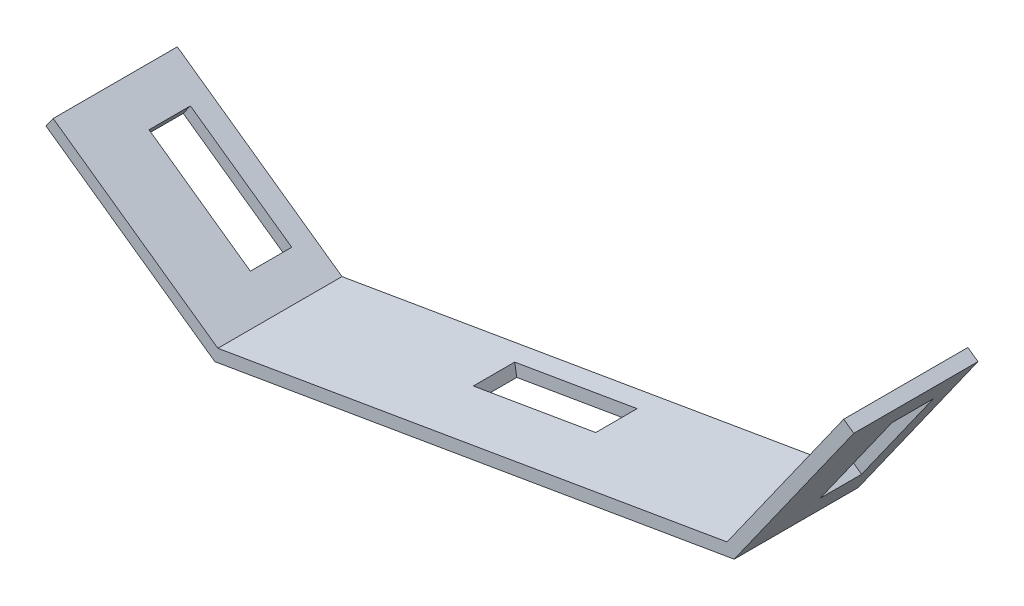
ISO-10303-21;
HEADER;
FILE_DESCRIPTION(('STEP AP214'),'2;1');
FILE_NAME('part.step','',(''),(''),'','','');
FILE_SCHEMA(('AUTOMOTIVE_DESIGN { 1 0 10303 214 1 1 1 1 }'));
ENDSEC;
DATA;
#1=APPLICATION_CONTEXT('core data for automotive mechanical design processes');
#2=APPLICATION_PROTOCOL_DEFINITION('international standard','automotive_design',2000,#1);
#3=PRODUCT_CONTEXT('',#1,'mechanical');
#4=PRODUCT('Part','Part','',(#3));
#5=PRODUCT_RELATED_PRODUCT_CATEGORY('part','',(#4));
#6=PRODUCT_DEFINITION_FORMATION('','',#4);
#7=PRODUCT_DEFINITION_CONTEXT('part definition',#1,'design');
#8=PRODUCT_DEFINITION('design','',#6,#7);
#9=PRODUCT_DEFINITION_SHAPE('','',#8);
#10=(LENGTH_UNIT() NAMED_UNIT(*) SI_UNIT(.MILLI.,.METRE.));
#11=(NAMED_UNIT(*) PLANE_ANGLE_UNIT() SI_UNIT($,.RADIAN.));
#12=(NAMED_UNIT(*) SI_UNIT($,.STERADIAN.) SOLID_ANGLE_UNIT());
#13=UNCERTAINTY_MEASURE_WITH_UNIT(LENGTH_MEASURE(1.E-05),#10,'distance_accuracy_value','');
#14=(GEOMETRIC_REPRESENTATION_CONTEXT(3) GLOBAL_UNCERTAINTY_ASSIGNED_CONTEXT((#13)) GLOBAL_UNIT_ASSIGNED_CONTEXT((#10,
#11,#12)) REPRESENTATION_CONTEXT('',''));
#15=CARTESIAN_POINT('',(0.,0.,0.));
#16=DIRECTION('',(0.,0.,1.));
#17=DIRECTION('',(1.,0.,0.));
#18=AXIS2_PLACEMENT_3D('',#15,#16,#17);
#19=CARTESIAN_POINT('',(-52.8419941794562,15.4027205499136,30.));
#20=DIRECTION('',(0.815952564194871,-0.578118857142556,0.));
#21=DIRECTION('',(0.578118857142556,0.815952564194871,0.));
#22=AXIS2_PLACEMENT_3D('',#19,#20,#21);
#23=PLANE('',#22);
#24=DIRECTION('',(-0.578118857142556,-0.815952564194871,0.));
#25=VECTOR('',#24,1.);
#26=CARTESIAN_POINT('',(-52.8419941794562,15.4027205499136,0.));
#27=LINE('',#26,#25);
#28=CARTESIAN_POINT('',(-51.1076376080285,17.8505782424982,0.));
#29=VERTEX_POINT('',#28);
#30=CARTESIAN_POINT('',(-52.8419941794562,15.4027205499136,0.));
#31=VERTEX_POINT('',#30);
#32=EDGE_CURVE('E239',#29,#31,#27,.T.);
#33=ORIENTED_EDGE('',*,*,#32,.T.);
#34=DIRECTION('',(0.,0.,-1.));
#35=VECTOR('',#34,1.);
#36=CARTESIAN_POINT('',(-52.8419941794562,15.4027205499136,30.));
#37=LINE('',#36,#35);
#38=CARTESIAN_POINT('',(-52.8419941794562,15.4027205499136,30.));
#39=VERTEX_POINT('',#38);
#40=EDGE_CURVE('E300',#39,#31,#37,.T.);
#41=ORIENTED_EDGE('',*,*,#40,.F.);
#42=DIRECTION('',(-0.578118857142556,-0.815952564194871,0.));
#43=VECTOR('',#42,1.);
#44=CARTESIAN_POINT('',(-52.8419941794562,15.4027205499136,30.));
#45=LINE('',#44,#43);
#46=CARTESIAN_POINT('',(-51.1076376080285,17.8505782424982,30.));
#47=VERTEX_POINT('',#46);
#48=EDGE_CURVE('E246',#47,#39,#45,.T.);
#49=ORIENTED_EDGE('',*,*,#48,.F.);
#50=DIRECTION('',(0.,0.,-1.));
#51=VECTOR('',#50,1.);
#52=CARTESIAN_POINT('',(-51.1076376080285,17.8505782424982,30.));
#53=LINE('',#52,#51);
#54=EDGE_CURVE('E264',#47,#29,#53,.T.);
#55=ORIENTED_EDGE('',*,*,#54,.T.);
#56=EDGE_LOOP('',(#33,#41,#49,#55));
#57=FACE_BOUND('',#56,.T.);
#58=ADVANCED_FACE('F41',(#57),#23,.F.);
#59=CARTESIAN_POINT('',(-52.8419941794562,15.4027205499136,30.));
#60=DIRECTION('',(0.578118857142555,0.815952564194871,0.));
#61=DIRECTION('',(-0.815952564194871,0.578118857142555,0.));
#62=AXIS2_PLACEMENT_3D('',#59,#60,#61);
#63=PLANE('',#62);
#64=DIRECTION('',(-0.815952564194872,0.578118857142555,0.));
#65=VECTOR('',#64,1.);
#66=CARTESIAN_POINT('',(-44.6824685375075,9.62153197848804,15.));
#67=LINE('',#66,#65);
#68=CARTESIAN_POINT('',(-20.2038916116614,-7.72203373578861,15.));
#69=VERTEX_POINT('',#68);
#70=CARTESIAN_POINT('',(-44.6824685375075,9.62153197848804,15.));
#71=VERTEX_POINT('',#70);
#72=EDGE_CURVE('E207',#69,#71,#67,.T.);
#73=ORIENTED_EDGE('',*,*,#72,.F.);
#74=DIRECTION('',(0.,0.,1.));
#75=VECTOR('',#74,1.);
#76=CARTESIAN_POINT('',(-20.2038916116614,-7.72203373578861,15.));
#77=LINE('',#76,#75);
#78=CARTESIAN_POINT('',(-20.2038916116614,-7.72203373578861,5.));
#79=VERTEX_POINT('',#78);
#80=EDGE_CURVE('E203',#79,#69,#77,.T.);
#81=ORIENTED_EDGE('',*,*,#80,.F.);
#82=DIRECTION('',(0.815952564194872,-0.578118857142555,0.));
#83=VECTOR('',#82,1.);
#84=CARTESIAN_POINT('',(-44.6824685375075,9.62153197848804,5.));
#85=LINE('',#84,#83);
#86=CARTESIAN_POINT('',(-44.6824685375075,9.62153197848804,5.));
#87=VERTEX_POINT('',#86);
#88=EDGE_CURVE('E213',#87,#79,#85,.T.);
#89=ORIENTED_EDGE('',*,*,#88,.F.);
#90=DIRECTION('',(0.,0.,-1.));
#91=VECTOR('',#90,1.);
#92=CARTESIAN_POINT('',(-44.6824685375075,9.62153197848804,15.));
#93=LINE('',#92,#91);
#94=EDGE_CURVE('E210',#71,#87,#93,.T.);
#95=ORIENTED_EDGE('',*,*,#94,.F.);
#96=EDGE_LOOP('',(#73,#81,#89,#95));
#97=FACE_BOUND('',#96,.T.);
#98=DIRECTION('',(0.815952564194871,-0.578118857142555,0.));
#99=VECTOR('',#98,1.);
#100=CARTESIAN_POINT('',(-52.8419941794562,15.4027205499136,0.));
#101=LINE('',#100,#99);
#102=CARTESIAN_POINT('',(-12.0443659697126,-13.5032223072142,0.));
#103=VERTEX_POINT('',#102);
#104=EDGE_CURVE('E267',#31,#103,#101,.T.);
#105=ORIENTED_EDGE('',*,*,#104,.T.);
#106=DIRECTION('',(0.,0.,-1.));
#107=VECTOR('',#106,1.);
#108=CARTESIAN_POINT('',(-12.0443659697126,-13.5032223072142,30.));
#109=LINE('',#108,#107);
#110=CARTESIAN_POINT('',(-12.0443659697126,-13.5032223072142,30.));
#111=VERTEX_POINT('',#110);
#112=EDGE_CURVE('E297',#111,#103,#109,.T.);
#113=ORIENTED_EDGE('',*,*,#112,.F.);
#114=DIRECTION('',(0.815952564194871,-0.578118857142555,0.));
#115=VECTOR('',#114,1.);
#116=CARTESIAN_POINT('',(-52.8419941794562,15.4027205499136,30.));
#117=LINE('',#116,#115);
#118=EDGE_CURVE('E249',#39,#111,#117,.T.);
#119=ORIENTED_EDGE('',*,*,#118,.F.);
#120=ORIENTED_EDGE('',*,*,#40,.T.);
#121=EDGE_LOOP('',(#105,#113,#119,#120));
#122=FACE_BOUND('',#121,.T.);
#123=ADVANCED_FACE('F352',(#97,#122),#63,.F.);
#124=CARTESIAN_POINT('',(-12.0443659697126,-13.5032223072142,30.));
#125=DIRECTION('',(-0.16817382705143,0.985757355486063,0.));
#126=DIRECTION('',(-0.985757355486063,-0.16817382705143,0.));
#127=AXIS2_PLACEMENT_3D('',#124,#125,#126);
#128=PLANE('',#127);
#129=DIRECTION('',(-0.985757355486063,-0.16817382705143,0.));
#130=VECTOR('',#129,1.);
#131=CARTESIAN_POINT('',(35.907466357681,-5.32246351120206,15.));
#132=LINE('',#131,#130);
#133=CARTESIAN_POINT('',(65.4801870222629,-0.277248699659165,15.));
#134=VERTEX_POINT('',#133);
#135=CARTESIAN_POINT('',(35.907466357681,-5.32246351120206,15.));
#136=VERTEX_POINT('',#135);
#137=EDGE_CURVE('E227',#134,#136,#132,.T.);
#138=ORIENTED_EDGE('',*,*,#137,.F.);
#139=DIRECTION('',(0.,0.,1.));
#140=VECTOR('',#139,1.);
#141=CARTESIAN_POINT('',(65.4801870222629,-0.277248699659168,15.));
#142=LINE('',#141,#140);
#143=CARTESIAN_POINT('',(65.4801870222629,-0.277248699659168,5.));
#144=VERTEX_POINT('',#143);
#145=EDGE_CURVE('E219',#144,#134,#142,.T.);
#146=ORIENTED_EDGE('',*,*,#145,.F.);
#147=DIRECTION('',(0.985757355486063,0.16817382705143,0.));
#148=VECTOR('',#147,1.);
#149=CARTESIAN_POINT('',(35.907466357681,-5.32246351120206,5.));
#150=LINE('',#149,#148);
#151=CARTESIAN_POINT('',(35.907466357681,-5.32246351120206,5.));
#152=VERTEX_POINT('',#151);
#153=EDGE_CURVE('E233',#152,#144,#150,.T.);
#154=ORIENTED_EDGE('',*,*,#153,.F.);
#155=DIRECTION('',(0.,0.,-1.));
#156=VECTOR('',#155,1.);
#157=CARTESIAN_POINT('',(35.907466357681,-5.32246351120206,15.));
#158=LINE('',#157,#156);
#159=EDGE_CURVE('E230',#136,#152,#158,.T.);
#160=ORIENTED_EDGE('',*,*,#159,.F.);
#161=EDGE_LOOP('',(#138,#146,#154,#160));
#162=FACE_BOUND('',#161,.T.);
#163=DIRECTION('',(0.985757355486063,0.16817382705143,0.));
#164=VECTOR('',#163,1.);
#165=CARTESIAN_POINT('',(-12.0443659697126,-13.5032223072142,0.));
#166=LINE('',#165,#164);
#167=CARTESIAN_POINT('',(113.432019349657,7.90351009635296,0.));
#168=VERTEX_POINT('',#167);
#169=EDGE_CURVE('E269',#103,#168,#166,.T.);
#170=ORIENTED_EDGE('',*,*,#169,.T.);
#171=DIRECTION('',(0.,0.,-1.));
#172=VECTOR('',#171,1.);
#173=CARTESIAN_POINT('',(113.432019349657,7.90351009635296,30.));
#174=LINE('',#173,#172);
#175=CARTESIAN_POINT('',(113.432019349657,7.90351009635296,30.));
#176=VERTEX_POINT('',#175);
#177=EDGE_CURVE('E294',#176,#168,#174,.T.);
#178=ORIENTED_EDGE('',*,*,#177,.F.);
#179=DIRECTION('',(0.985757355486063,0.16817382705143,0.));
#180=VECTOR('',#179,1.);
#181=CARTESIAN_POINT('',(-12.0443659697126,-13.5032223072142,30.));
#182=LINE('',#181,#180);
#183=EDGE_CURVE('E252',#111,#176,#182,.T.);
#184=ORIENTED_EDGE('',*,*,#183,.F.);
#185=ORIENTED_EDGE('',*,*,#112,.T.);
#186=EDGE_LOOP('',(#170,#178,#184,#185));
#187=FACE_BOUND('',#186,.T.);
#188=ADVANCED_FACE('F358',(#162,#187),#128,.F.);
#189=CARTESIAN_POINT('',(113.432019349657,7.90351009635296,30.));
#190=DIRECTION('',(-0.815952564194874,0.578118857142552,0.));
#191=DIRECTION('',(-0.578118857142552,-0.815952564194874,0.));
#192=AXIS2_PLACEMENT_3D('',#189,#190,#191);
#193=PLANE('',#192);
#194=DIRECTION('',(0.,0.,1.));
#195=VECTOR('',#194,1.);
#196=CARTESIAN_POINT('',(136.556773635359,40.5416126641479,15.));
#197=LINE('',#196,#195);
#198=CARTESIAN_POINT('',(136.556773635359,40.5416126641479,5.));
#199=VERTEX_POINT('',#198);
#200=CARTESIAN_POINT('',(136.556773635359,40.5416126641479,15.));
#201=VERTEX_POINT('',#200);
#202=EDGE_CURVE('E189',#199,#201,#197,.T.);
#203=ORIENTED_EDGE('',*,*,#202,.F.);
#204=DIRECTION('',(0.578118857142552,0.815952564194874,0.));
#205=VECTOR('',#204,1.);
#206=CARTESIAN_POINT('',(136.556773635359,40.5416126641479,5.));
#207=LINE('',#206,#205);
#208=CARTESIAN_POINT('',(119.213207921082,16.0630357383017,5.));
#209=VERTEX_POINT('',#208);
#210=EDGE_CURVE('E55',#209,#199,#207,.T.);
#211=ORIENTED_EDGE('',*,*,#210,.F.);
#212=DIRECTION('',(0.,0.,-1.));
#213=VECTOR('',#212,1.);
#214=CARTESIAN_POINT('',(119.213207921082,16.0630357383017,15.));
#215=LINE('',#214,#213);
#216=CARTESIAN_POINT('',(119.213207921082,16.0630357383017,15.));
#217=VERTEX_POINT('',#216);
#218=EDGE_CURVE('E196',#217,#209,#215,.T.);
#219=ORIENTED_EDGE('',*,*,#218,.F.);
#220=DIRECTION('',(-0.578118857142552,-0.815952564194874,0.));
#221=VECTOR('',#220,1.);
#222=CARTESIAN_POINT('',(136.556773635359,40.5416126641479,15.));
#223=LINE('',#222,#221);
#224=EDGE_CURVE('E180',#201,#217,#223,.T.);
#225=ORIENTED_EDGE('',*,*,#224,.F.);
#226=EDGE_LOOP('',(#203,#211,#219,#225));
#227=FACE_BOUND('',#226,.T.);
#228=DIRECTION('',(0.578118857142552,0.815952564194874,0.));
#229=VECTOR('',#228,1.);
#230=CARTESIAN_POINT('',(113.432019349657,7.90351009635296,0.));
#231=LINE('',#230,#229);
#232=CARTESIAN_POINT('',(142.337962206784,48.7011383060966,0.));
#233=VERTEX_POINT('',#232);
#234=EDGE_CURVE('E271',#168,#233,#231,.T.);
#235=ORIENTED_EDGE('',*,*,#234,.T.);
#236=DIRECTION('',(0.,0.,-1.));
#237=VECTOR('',#236,1.);
#238=CARTESIAN_POINT('',(142.337962206784,48.7011383060966,30.));
#239=LINE('',#238,#237);
#240=CARTESIAN_POINT('',(142.337962206784,48.7011383060966,30.));
#241=VERTEX_POINT('',#240);
#242=EDGE_CURVE('E291',#241,#233,#239,.T.);
#243=ORIENTED_EDGE('',*,*,#242,.F.);
#244=DIRECTION('',(0.578118857142552,0.815952564194874,0.));
#245=VECTOR('',#244,1.);
#246=CARTESIAN_POINT('',(113.432019349657,7.90351009635296,30.));
#247=LINE('',#246,#245);
#248=EDGE_CURVE('E254',#176,#241,#247,.T.);
#249=ORIENTED_EDGE('',*,*,#248,.F.);
#250=ORIENTED_EDGE('',*,*,#177,.T.);
#251=EDGE_LOOP('',(#235,#243,#249,#250));
#252=FACE_BOUND('',#251,.T.);
#253=ADVANCED_FACE('F193',(#227,#252),#193,.F.);
#254=CARTESIAN_POINT('',(139.8901045142,50.4354948775243,30.));
#255=DIRECTION('',(-0.578118857142551,-0.815952564194874,0.));
#256=DIRECTION('',(0.815952564194875,-0.578118857142551,0.));
#257=AXIS2_PLACEMENT_3D('',#254,#255,#256);
#258=PLANE('',#257);
#259=DIRECTION('',(-0.815952564194874,0.578118857142551,0.));
#260=VECTOR('',#259,1.);
#261=CARTESIAN_POINT('',(139.8901045142,50.4354948775243,0.));
#262=LINE('',#261,#260);
#263=CARTESIAN_POINT('',(139.8901045142,50.4354948775243,0.));
#264=VERTEX_POINT('',#263);
#265=EDGE_CURVE('E273',#233,#264,#262,.T.);
#266=ORIENTED_EDGE('',*,*,#265,.T.);
#267=DIRECTION('',(0.,0.,-1.));
#268=VECTOR('',#267,1.);
#269=CARTESIAN_POINT('',(139.8901045142,50.4354948775243,30.));
#270=LINE('',#269,#268);
#271=CARTESIAN_POINT('',(139.8901045142,50.4354948775243,30.));
#272=VERTEX_POINT('',#271);
#273=EDGE_CURVE('E288',#272,#264,#270,.T.);
#274=ORIENTED_EDGE('',*,*,#273,.F.);
#275=DIRECTION('',(-0.815952564194874,0.578118857142551,0.));
#276=VECTOR('',#275,1.);
#277=CARTESIAN_POINT('',(139.8901045142,50.4354948775243,30.));
#278=LINE('',#277,#276);
#279=EDGE_CURVE('E256',#241,#272,#278,.T.);
#280=ORIENTED_EDGE('',*,*,#279,.F.);
#281=ORIENTED_EDGE('',*,*,#242,.T.);
#282=EDGE_LOOP('',(#266,#274,#280,#281));
#283=FACE_BOUND('',#282,.T.);
#284=ADVANCED_FACE('F389',(#283),#258,.F.);
#285=CARTESIAN_POINT('',(111.702555670948,10.6518025228085,30.));
#286=DIRECTION('',(0.815952564194874,-0.578118857142552,0.));
#287=DIRECTION('',(0.578118857142552,0.815952564194874,0.));
#288=AXIS2_PLACEMENT_3D('',#285,#286,#287);
#289=PLANE('',#288);
#290=DIRECTION('',(0.,0.,-1.));
#291=VECTOR('',#290,1.);
#292=CARTESIAN_POINT('',(116.765350228498,17.7973923097294,30.));
#293=LINE('',#292,#291);
#294=CARTESIAN_POINT('',(116.765350228498,17.7973923097294,15.));
#295=VERTEX_POINT('',#294);
#296=CARTESIAN_POINT('',(116.765350228498,17.7973923097294,5.));
#297=VERTEX_POINT('',#296);
#298=EDGE_CURVE('E48',#295,#297,#293,.T.);
#299=ORIENTED_EDGE('',*,*,#298,.T.);
#300=DIRECTION('',(0.578118857142552,0.815952564194874,0.));
#301=VECTOR('',#300,1.);
#302=CARTESIAN_POINT('',(111.702555670948,10.6518025228085,4.99999999999999));
#303=LINE('',#302,#301);
#304=CARTESIAN_POINT('',(134.108915942774,42.2759692355756,5.));
#305=VERTEX_POINT('',#304);
#306=EDGE_CURVE('E11',#297,#305,#303,.T.);
#307=ORIENTED_EDGE('',*,*,#306,.T.);
#308=DIRECTION('',(0.,0.,1.));
#309=VECTOR('',#308,1.);
#310=CARTESIAN_POINT('',(134.108915942774,42.2759692355756,30.));
#311=LINE('',#310,#309);
#312=CARTESIAN_POINT('',(134.108915942774,42.2759692355756,15.));
#313=VERTEX_POINT('',#312);
#314=EDGE_CURVE('E327',#305,#313,#311,.T.);
#315=ORIENTED_EDGE('',*,*,#314,.T.);
#316=DIRECTION('',(-0.578118857142552,-0.815952564194874,0.));
#317=VECTOR('',#316,1.);
#318=CARTESIAN_POINT('',(111.702555670948,10.6518025228085,15.));
#319=LINE('',#318,#317);
#320=EDGE_CURVE('E183',#313,#295,#319,.T.);
#321=ORIENTED_EDGE('',*,*,#320,.T.);
#322=EDGE_LOOP('',(#299,#307,#315,#321));
#323=FACE_BOUND('',#322,.T.);
#324=DIRECTION('',(-0.578118857142552,-0.815952564194874,0.));
#325=VECTOR('',#324,1.);
#326=CARTESIAN_POINT('',(111.702555670948,10.6518025228085,0.));
#327=LINE('',#326,#325);
#328=CARTESIAN_POINT('',(111.702555670948,10.6518025228085,0.));
#329=VERTEX_POINT('',#328);
#330=EDGE_CURVE('E275',#264,#329,#327,.T.);
#331=ORIENTED_EDGE('',*,*,#330,.T.);
#332=DIRECTION('',(0.,0.,-1.));
#333=VECTOR('',#332,1.);
#334=CARTESIAN_POINT('',(111.702555670948,10.6518025228085,30.));
#335=LINE('',#334,#333);
#336=CARTESIAN_POINT('',(111.702555670948,10.6518025228085,30.));
#337=VERTEX_POINT('',#336);
#338=EDGE_CURVE('E285',#337,#329,#335,.T.);
#339=ORIENTED_EDGE('',*,*,#338,.F.);
#340=DIRECTION('',(-0.578118857142552,-0.815952564194874,0.));
#341=VECTOR('',#340,1.);
#342=CARTESIAN_POINT('',(111.702555670948,10.6518025228085,30.));
#343=LINE('',#342,#341);
#344=EDGE_CURVE('E258',#272,#337,#343,.T.);
#345=ORIENTED_EDGE('',*,*,#344,.F.);
#346=ORIENTED_EDGE('',*,*,#273,.T.);
#347=EDGE_LOOP('',(#331,#339,#345,#346));
#348=FACE_BOUND('',#347,.T.);
#349=ADVANCED_FACE('F331',(#323,#348),#289,.F.);
#350=CARTESIAN_POINT('',(-11.3239452533128,-10.3369706007533,30.));
#351=DIRECTION('',(0.16817382705143,-0.985757355486063,0.));
#352=DIRECTION('',(0.985757355486063,0.16817382705143,0.));
#353=AXIS2_PLACEMENT_3D('',#350,#351,#352);
#354=PLANE('',#353);
#355=DIRECTION('',(0.985757355486063,0.16817382705143,0.));
#356=VECTOR('',#355,1.);
#357=CARTESIAN_POINT('',(-11.3239452533128,-10.3369706007533,5.));
#358=LINE('',#357,#356);
#359=CARTESIAN_POINT('',(35.4029448765268,-2.36519144474386,5.));
#360=VERTEX_POINT('',#359);
#361=CARTESIAN_POINT('',(64.9756655411086,2.68002336679903,5.));
#362=VERTEX_POINT('',#361);
#363=EDGE_CURVE('E309',#360,#362,#358,.T.);
#364=ORIENTED_EDGE('',*,*,#363,.T.);
#365=DIRECTION('',(0.,0.,1.));
#366=VECTOR('',#365,1.);
#367=CARTESIAN_POINT('',(64.9756655411087,2.68002336679903,30.));
#368=LINE('',#367,#366);
#369=CARTESIAN_POINT('',(64.9756655411086,2.68002336679903,15.));
#370=VERTEX_POINT('',#369);
#371=EDGE_CURVE('E312',#362,#370,#368,.T.);
#372=ORIENTED_EDGE('',*,*,#371,.T.);
#373=DIRECTION('',(-0.985757355486063,-0.16817382705143,0.));
#374=VECTOR('',#373,1.);
#375=CARTESIAN_POINT('',(-11.3239452533128,-10.3369706007533,15.));
#376=LINE('',#375,#374);
#377=CARTESIAN_POINT('',(35.4029448765268,-2.36519144474386,15.));
#378=VERTEX_POINT('',#377);
#379=EDGE_CURVE('E303',#370,#378,#376,.T.);
#380=ORIENTED_EDGE('',*,*,#379,.T.);
#381=DIRECTION('',(0.,0.,-1.));
#382=VECTOR('',#381,1.);
#383=CARTESIAN_POINT('',(35.4029448765268,-2.36519144474386,30.));
#384=LINE('',#383,#382);
#385=EDGE_CURVE('E306',#378,#360,#384,.T.);
#386=ORIENTED_EDGE('',*,*,#385,.T.);
#387=EDGE_LOOP('',(#364,#372,#380,#386));
#388=FACE_BOUND('',#387,.T.);
#389=DIRECTION('',(-0.985757355486063,-0.16817382705143,0.));
#390=VECTOR('',#389,1.);
#391=CARTESIAN_POINT('',(-11.3239452533128,-10.3369706007533,0.));
#392=LINE('',#391,#390);
#393=CARTESIAN_POINT('',(-11.3239452533128,-10.3369706007533,0.));
#394=VERTEX_POINT('',#393);
#395=EDGE_CURVE('E277',#329,#394,#392,.T.);
#396=ORIENTED_EDGE('',*,*,#395,.T.);
#397=DIRECTION('',(0.,0.,-1.));
#398=VECTOR('',#397,1.);
#399=CARTESIAN_POINT('',(-11.3239452533128,-10.3369706007533,30.));
#400=LINE('',#399,#398);
#401=CARTESIAN_POINT('',(-11.3239452533128,-10.3369706007533,30.));
#402=VERTEX_POINT('',#401);
#403=EDGE_CURVE('E282',#402,#394,#400,.T.);
#404=ORIENTED_EDGE('',*,*,#403,.F.);
#405=DIRECTION('',(-0.985757355486063,-0.16817382705143,0.));
#406=VECTOR('',#405,1.);
#407=CARTESIAN_POINT('',(-11.3239452533128,-10.3369706007533,30.));
#408=LINE('',#407,#406);
#409=EDGE_CURVE('E260',#337,#402,#408,.T.);
#410=ORIENTED_EDGE('',*,*,#409,.F.);
#411=ORIENTED_EDGE('',*,*,#338,.T.);
#412=EDGE_LOOP('',(#396,#404,#410,#411));
#413=FACE_BOUND('',#412,.T.);
#414=ADVANCED_FACE('F381',(#388,#413),#354,.F.);
#415=CARTESIAN_POINT('',(-51.1076376080285,17.8505782424982,30.));
#416=DIRECTION('',(-0.578118857142555,-0.815952564194871,0.));
#417=DIRECTION('',(0.815952564194872,-0.578118857142555,0.));
#418=AXIS2_PLACEMENT_3D('',#415,#416,#417);
#419=PLANE('',#418);
#420=DIRECTION('',(0.815952564194872,-0.578118857142555,0.));
#421=VECTOR('',#420,1.);
#422=CARTESIAN_POINT('',(-51.1076376080285,17.8505782424982,5.));
#423=LINE('',#422,#421);
#424=CARTESIAN_POINT('',(-42.9481119660798,12.0693896710727,5.));
#425=VERTEX_POINT('',#424);
#426=CARTESIAN_POINT('',(-18.4695350402337,-5.274176043204,5.));
#427=VERTEX_POINT('',#426);
#428=EDGE_CURVE('E321',#425,#427,#423,.T.);
#429=ORIENTED_EDGE('',*,*,#428,.T.);
#430=DIRECTION('',(0.,0.,1.));
#431=VECTOR('',#430,1.);
#432=CARTESIAN_POINT('',(-18.4695350402337,-5.274176043204,30.));
#433=LINE('',#432,#431);
#434=CARTESIAN_POINT('',(-18.4695350402337,-5.274176043204,15.));
#435=VERTEX_POINT('',#434);
#436=EDGE_CURVE('E324',#427,#435,#433,.T.);
#437=ORIENTED_EDGE('',*,*,#436,.T.);
#438=DIRECTION('',(-0.815952564194872,0.578118857142555,0.));
#439=VECTOR('',#438,1.);
#440=CARTESIAN_POINT('',(-51.1076376080285,17.8505782424982,15.));
#441=LINE('',#440,#439);
#442=CARTESIAN_POINT('',(-42.9481119660798,12.0693896710727,15.));
#443=VERTEX_POINT('',#442);
#444=EDGE_CURVE('E315',#435,#443,#441,.T.);
#445=ORIENTED_EDGE('',*,*,#444,.T.);
#446=DIRECTION('',(0.,0.,-1.));
#447=VECTOR('',#446,1.);
#448=CARTESIAN_POINT('',(-42.9481119660798,12.0693896710727,30.));
#449=LINE('',#448,#447);
#450=EDGE_CURVE('E318',#443,#425,#449,.T.);
#451=ORIENTED_EDGE('',*,*,#450,.T.);
#452=EDGE_LOOP('',(#429,#437,#445,#451));
#453=FACE_BOUND('',#452,.T.);
#454=DIRECTION('',(-0.815952564194871,0.578118857142555,0.));
#455=VECTOR('',#454,1.);
#456=CARTESIAN_POINT('',(-51.1076376080285,17.8505782424982,0.));
#457=LINE('',#456,#455);
#458=EDGE_CURVE('E250',#394,#29,#457,.T.);
#459=ORIENTED_EDGE('',*,*,#458,.T.);
#460=ORIENTED_EDGE('',*,*,#54,.F.);
#461=DIRECTION('',(-0.815952564194871,0.578118857142555,0.));
#462=VECTOR('',#461,1.);
#463=CARTESIAN_POINT('',(-51.1076376080285,17.8505782424982,30.));
#464=LINE('',#463,#462);
#465=EDGE_CURVE('E262',#402,#47,#464,.T.);
#466=ORIENTED_EDGE('',*,*,#465,.F.);
#467=ORIENTED_EDGE('',*,*,#403,.T.);
#468=EDGE_LOOP('',(#459,#460,#466,#467));
#469=FACE_BOUND('',#468,.T.);
#470=ADVANCED_FACE('F379',(#453,#469),#419,.F.);
#471=CARTESIAN_POINT('',(0.,0.,30.));
#472=DIRECTION('',(0.,0.,-1.));
#473=DIRECTION('',(-1.,0.,0.));
#474=AXIS2_PLACEMENT_3D('',#471,#472,#473);
#475=PLANE('',#474);
#476=ORIENTED_EDGE('',*,*,#48,.T.);
#477=ORIENTED_EDGE('',*,*,#118,.T.);
#478=ORIENTED_EDGE('',*,*,#183,.T.);
#479=ORIENTED_EDGE('',*,*,#248,.T.);
#480=ORIENTED_EDGE('',*,*,#279,.T.);
#481=ORIENTED_EDGE('',*,*,#344,.T.);
#482=ORIENTED_EDGE('',*,*,#409,.T.);
#483=ORIENTED_EDGE('',*,*,#465,.T.);
#484=EDGE_LOOP('',(#476,#477,#478,#479,#480,#481,#482,#483));
#485=FACE_BOUND('',#484,.T.);
#486=ADVANCED_FACE('F374',(#485),#475,.F.);
#487=CARTESIAN_POINT('',(0.,0.,0.));
#488=DIRECTION('',(0.,0.,-1.));
#489=DIRECTION('',(-1.,0.,0.));
#490=AXIS2_PLACEMENT_3D('',#487,#488,#489);
#491=PLANE('',#490);
#492=ORIENTED_EDGE('',*,*,#32,.F.);
#493=ORIENTED_EDGE('',*,*,#458,.F.);
#494=ORIENTED_EDGE('',*,*,#395,.F.);
#495=ORIENTED_EDGE('',*,*,#330,.F.);
#496=ORIENTED_EDGE('',*,*,#265,.F.);
#497=ORIENTED_EDGE('',*,*,#234,.F.);
#498=ORIENTED_EDGE('',*,*,#169,.F.);
#499=ORIENTED_EDGE('',*,*,#104,.F.);
#500=EDGE_LOOP('',(#492,#493,#494,#495,#496,#497,#498,#499));
#501=FACE_BOUND('',#500,.T.);
#502=ADVANCED_FACE('F366',(#501),#491,.T.);
#503=CARTESIAN_POINT('',(61.7803628271315,21.4094131210342,15.));
#504=DIRECTION('',(0.985757355486063,0.16817382705143,0.));
#505=DIRECTION('',(-0.16817382705143,0.985757355486063,0.));
#506=AXIS2_PLACEMENT_3D('',#503,#504,#505);
#507=PLANE('',#506);
#508=DIRECTION('',(0.16817382705143,-0.985757355486063,0.));
#509=VECTOR('',#508,1.);
#510=CARTESIAN_POINT('',(61.7803628271315,21.4094131210342,5.));
#511=LINE('',#510,#509);
#512=EDGE_CURVE('E237',#362,#144,#511,.T.);
#513=ORIENTED_EDGE('',*,*,#512,.T.);
#514=ORIENTED_EDGE('',*,*,#145,.T.);
#515=DIRECTION('',(0.16817382705143,-0.985757355486063,0.));
#516=VECTOR('',#515,1.);
#517=CARTESIAN_POINT('',(61.7803628271315,21.4094131210342,15.));
#518=LINE('',#517,#516);
#519=EDGE_CURVE('E236',#370,#134,#518,.T.);
#520=ORIENTED_EDGE('',*,*,#519,.F.);
#521=ORIENTED_EDGE('',*,*,#371,.F.);
#522=EDGE_LOOP('',(#513,#514,#520,#521));
#523=FACE_BOUND('',#522,.T.);
#524=ADVANCED_FACE('F413',(#523),#507,.F.);
#525=CARTESIAN_POINT('',(32.2076421625496,16.3641983094913,5.));
#526=DIRECTION('',(0.,0.,-1.));
#527=DIRECTION('',(-1.,0.,0.));
#528=AXIS2_PLACEMENT_3D('',#525,#526,#527);
#529=PLANE('',#528);
#530=DIRECTION('',(0.16817382705143,-0.985757355486063,0.));
#531=VECTOR('',#530,1.);
#532=CARTESIAN_POINT('',(32.2076421625496,16.3641983094913,5.));
#533=LINE('',#532,#531);
#534=EDGE_CURVE('E240',#360,#152,#533,.T.);
#535=ORIENTED_EDGE('',*,*,#534,.T.);
#536=ORIENTED_EDGE('',*,*,#153,.T.);
#537=ORIENTED_EDGE('',*,*,#512,.F.);
#538=ORIENTED_EDGE('',*,*,#363,.F.);
#539=EDGE_LOOP('',(#535,#536,#537,#538));
#540=FACE_BOUND('',#539,.T.);
#541=ADVANCED_FACE('F418',(#540),#529,.F.);
#542=CARTESIAN_POINT('',(32.2076421625496,16.3641983094913,15.));
#543=DIRECTION('',(-0.985757355486063,-0.16817382705143,0.));
#544=DIRECTION('',(0.16817382705143,-0.985757355486063,0.));
#545=AXIS2_PLACEMENT_3D('',#542,#543,#544);
#546=PLANE('',#545);
#547=DIRECTION('',(0.16817382705143,-0.985757355486063,0.));
#548=VECTOR('',#547,1.);
#549=CARTESIAN_POINT('',(32.2076421625496,16.3641983094913,15.));
#550=LINE('',#549,#548);
#551=EDGE_CURVE('E242',#378,#136,#550,.T.);
#552=ORIENTED_EDGE('',*,*,#551,.T.);
#553=ORIENTED_EDGE('',*,*,#159,.T.);
#554=ORIENTED_EDGE('',*,*,#534,.F.);
#555=ORIENTED_EDGE('',*,*,#385,.F.);
#556=EDGE_LOOP('',(#552,#553,#554,#555));
#557=FACE_BOUND('',#556,.T.);
#558=ADVANCED_FACE('F424',(#557),#546,.F.);
#559=CARTESIAN_POINT('',(32.2076421625496,16.3641983094913,15.));
#560=DIRECTION('',(0.,0.,1.));
#561=DIRECTION('',(1.,0.,0.));
#562=AXIS2_PLACEMENT_3D('',#559,#560,#561);
#563=PLANE('',#562);
#564=ORIENTED_EDGE('',*,*,#519,.T.);
#565=ORIENTED_EDGE('',*,*,#137,.T.);
#566=ORIENTED_EDGE('',*,*,#551,.F.);
#567=ORIENTED_EDGE('',*,*,#379,.F.);
#568=EDGE_LOOP('',(#564,#565,#566,#567));
#569=FACE_BOUND('',#568,.T.);
#570=ADVANCED_FACE('F420',(#569),#563,.F.);
#571=CARTESIAN_POINT('',(-7.48527675452515,10.2289226764986,15.));
#572=DIRECTION('',(0.815952564194871,-0.578118857142555,0.));
#573=DIRECTION('',(0.578118857142555,0.815952564194871,0.));
#574=AXIS2_PLACEMENT_3D('',#571,#572,#573);
#575=PLANE('',#574);
#576=DIRECTION('',(-0.578118857142555,-0.815952564194871,0.));
#577=VECTOR('',#576,1.);
#578=CARTESIAN_POINT('',(-7.48527675452515,10.2289226764986,5.));
#579=LINE('',#578,#577);
#580=EDGE_CURVE('E217',#427,#79,#579,.T.);
#581=ORIENTED_EDGE('',*,*,#580,.T.);
#582=ORIENTED_EDGE('',*,*,#80,.T.);
#583=DIRECTION('',(-0.578118857142555,-0.815952564194871,0.));
#584=VECTOR('',#583,1.);
#585=CARTESIAN_POINT('',(-7.48527675452515,10.2289226764986,15.));
#586=LINE('',#585,#584);
#587=EDGE_CURVE('E216',#435,#69,#586,.T.);
#588=ORIENTED_EDGE('',*,*,#587,.F.);
#589=ORIENTED_EDGE('',*,*,#436,.F.);
#590=EDGE_LOOP('',(#581,#582,#588,#589));
#591=FACE_BOUND('',#590,.T.);
#592=ADVANCED_FACE('F423',(#591),#575,.F.);
#593=CARTESIAN_POINT('',(-31.9638536803713,27.5724883907752,5.));
#594=DIRECTION('',(0.,0.,-1.));
#595=DIRECTION('',(-1.,0.,0.));
#596=AXIS2_PLACEMENT_3D('',#593,#594,#595);
#597=PLANE('',#596);
#598=DIRECTION('',(-0.578118857142555,-0.815952564194871,0.));
#599=VECTOR('',#598,1.);
#600=CARTESIAN_POINT('',(-31.9638536803713,27.5724883907752,5.));
#601=LINE('',#600,#599);
#602=EDGE_CURVE('E220',#425,#87,#601,.T.);
#603=ORIENTED_EDGE('',*,*,#602,.T.);
#604=ORIENTED_EDGE('',*,*,#88,.T.);
#605=ORIENTED_EDGE('',*,*,#580,.F.);
#606=ORIENTED_EDGE('',*,*,#428,.F.);
#607=EDGE_LOOP('',(#603,#604,#605,#606));
#608=FACE_BOUND('',#607,.T.);
#609=ADVANCED_FACE('F433',(#608),#597,.F.);
#610=CARTESIAN_POINT('',(-31.9638536803713,27.5724883907752,15.));
#611=DIRECTION('',(-0.815952564194871,0.578118857142555,0.));
#612=DIRECTION('',(-0.578118857142555,-0.815952564194871,0.));
#613=AXIS2_PLACEMENT_3D('',#610,#611,#612);
#614=PLANE('',#613);
#615=DIRECTION('',(-0.578118857142555,-0.815952564194871,0.));
#616=VECTOR('',#615,1.);
#617=CARTESIAN_POINT('',(-31.9638536803713,27.5724883907752,15.));
#618=LINE('',#617,#616);
#619=EDGE_CURVE('E222',#443,#71,#618,.T.);
#620=ORIENTED_EDGE('',*,*,#619,.T.);
#621=ORIENTED_EDGE('',*,*,#94,.T.);
#622=ORIENTED_EDGE('',*,*,#602,.F.);
#623=ORIENTED_EDGE('',*,*,#450,.F.);
#624=EDGE_LOOP('',(#620,#621,#622,#623));
#625=FACE_BOUND('',#624,.T.);
#626=ADVANCED_FACE('F346',(#625),#614,.F.);
#627=CARTESIAN_POINT('',(-31.9638536803713,27.5724883907752,15.));
#628=DIRECTION('',(0.,0.,1.));
#629=DIRECTION('',(1.,0.,0.));
#630=AXIS2_PLACEMENT_3D('',#627,#628,#629);
#631=PLANE('',#630);
#632=ORIENTED_EDGE('',*,*,#587,.T.);
#633=ORIENTED_EDGE('',*,*,#72,.T.);
#634=ORIENTED_EDGE('',*,*,#619,.F.);
#635=ORIENTED_EDGE('',*,*,#444,.F.);
#636=EDGE_LOOP('',(#632,#633,#634,#635));
#637=FACE_BOUND('',#636,.T.);
#638=ADVANCED_FACE('F338',(#637),#631,.F.);
#639=CARTESIAN_POINT('',(118.605817223072,53.2602275212841,5.));
#640=DIRECTION('',(0.,0.,-1.));
#641=DIRECTION('',(0.,1.,0.));
#642=AXIS2_PLACEMENT_3D('',#639,#640,#641);
#643=PLANE('',#642);
#644=DIRECTION('',(0.815952564194874,-0.578118857142552,0.));
#645=VECTOR('',#644,1.);
#646=CARTESIAN_POINT('',(101.262251508795,28.7816505954378,5.));
#647=LINE('',#646,#645);
#648=EDGE_CURVE('E201',#297,#209,#647,.T.);
#649=ORIENTED_EDGE('',*,*,#648,.T.);
#650=ORIENTED_EDGE('',*,*,#210,.T.);
#651=DIRECTION('',(0.815952564194874,-0.578118857142552,0.));
#652=VECTOR('',#651,1.);
#653=CARTESIAN_POINT('',(118.605817223072,53.2602275212841,5.));
#654=LINE('',#653,#652);
#655=EDGE_CURVE('E186',#305,#199,#654,.T.);
#656=ORIENTED_EDGE('',*,*,#655,.F.);
#657=ORIENTED_EDGE('',*,*,#306,.F.);
#658=EDGE_LOOP('',(#649,#650,#656,#657));
#659=FACE_BOUND('',#658,.T.);
#660=ADVANCED_FACE('F336',(#659),#643,.F.);
#661=CARTESIAN_POINT('',(101.262251508795,28.7816505954378,15.));
#662=DIRECTION('',(-0.578118857142552,-0.815952564194874,0.));
#663=DIRECTION('',(0.815952564194874,-0.578118857142552,0.));
#664=AXIS2_PLACEMENT_3D('',#661,#662,#663);
#665=PLANE('',#664);
#666=DIRECTION('',(0.815952564194874,-0.578118857142552,0.));
#667=VECTOR('',#666,1.);
#668=CARTESIAN_POINT('',(101.262251508795,28.7816505954378,15.));
#669=LINE('',#668,#667);
#670=EDGE_CURVE('E185',#295,#217,#669,.T.);
#671=ORIENTED_EDGE('',*,*,#670,.T.);
#672=ORIENTED_EDGE('',*,*,#218,.T.);
#673=ORIENTED_EDGE('',*,*,#648,.F.);
#674=ORIENTED_EDGE('',*,*,#298,.F.);
#675=EDGE_LOOP('',(#671,#672,#673,#674));
#676=FACE_BOUND('',#675,.T.);
#677=ADVANCED_FACE('F335',(#676),#665,.F.);
#678=CARTESIAN_POINT('',(118.605817223072,53.2602275212841,15.));
#679=DIRECTION('',(0.,0.,1.));
#680=DIRECTION('',(1.,0.,0.));
#681=AXIS2_PLACEMENT_3D('',#678,#679,#680);
#682=PLANE('',#681);
#683=DIRECTION('',(0.815952564194874,-0.578118857142552,0.));
#684=VECTOR('',#683,1.);
#685=CARTESIAN_POINT('',(118.605817223072,53.2602275212841,15.));
#686=LINE('',#685,#684);
#687=EDGE_CURVE('E63',#313,#201,#686,.T.);
#688=ORIENTED_EDGE('',*,*,#687,.T.);
#689=ORIENTED_EDGE('',*,*,#224,.T.);
#690=ORIENTED_EDGE('',*,*,#670,.F.);
#691=ORIENTED_EDGE('',*,*,#320,.F.);
#692=EDGE_LOOP('',(#688,#689,#690,#691));
#693=FACE_BOUND('',#692,.T.);
#694=ADVANCED_FACE('F177',(#693),#682,.F.);
#695=CARTESIAN_POINT('',(118.605817223072,53.2602275212841,15.));
#696=DIRECTION('',(0.578118857142552,0.815952564194874,0.));
#697=DIRECTION('',(-0.815952564194874,0.578118857142552,0.));
#698=AXIS2_PLACEMENT_3D('',#695,#696,#697);
#699=PLANE('',#698);
#700=ORIENTED_EDGE('',*,*,#655,.T.);
#701=ORIENTED_EDGE('',*,*,#202,.T.);
#702=ORIENTED_EDGE('',*,*,#687,.F.);
#703=ORIENTED_EDGE('',*,*,#314,.F.);
#704=EDGE_LOOP('',(#700,#701,#702,#703));
#705=FACE_BOUND('',#704,.T.);
#706=ADVANCED_FACE('F190',(#705),#699,.F.);
#707=CLOSED_SHELL('',(#58,#123,#188,#253,#284,#349,#414,#470,#486,#502,#524,#541,#558,#570,#592,
#609,#626,#638,#660,#677,#694,#706));
#708=MANIFOLD_SOLID_BREP('B2',#707);
#709=ADVANCED_BREP_SHAPE_REPRESENTATION('',(#18,#708),#14);
#710=SHAPE_DEFINITION_REPRESENTATION(#9,#709);
ENDSEC;
END-ISO-10303-21;
